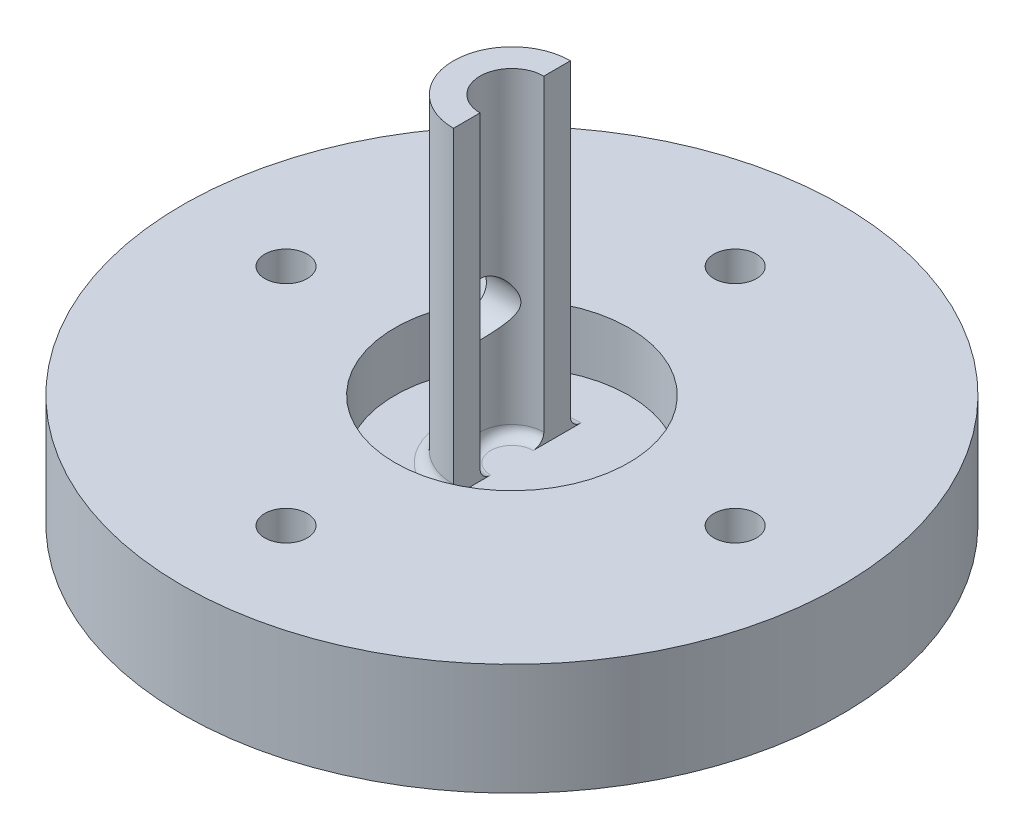
ISO-10303-21;
HEADER;
FILE_DESCRIPTION(('STEP AP214'),'2;1');
FILE_NAME('part.step','',(''),(''),'','','');
FILE_SCHEMA(('AUTOMOTIVE_DESIGN { 1 0 10303 214 1 1 1 1 }'));
ENDSEC;
DATA;
#1=APPLICATION_CONTEXT('core data for automotive mechanical design processes');
#2=APPLICATION_PROTOCOL_DEFINITION('international standard','automotive_design',2000,#1);
#3=PRODUCT_CONTEXT('',#1,'mechanical');
#4=PRODUCT('Part','Part','',(#3));
#5=PRODUCT_RELATED_PRODUCT_CATEGORY('part','',(#4));
#6=PRODUCT_DEFINITION_FORMATION('','',#4);
#7=PRODUCT_DEFINITION_CONTEXT('part definition',#1,'design');
#8=PRODUCT_DEFINITION('design','',#6,#7);
#9=PRODUCT_DEFINITION_SHAPE('','',#8);
#10=(LENGTH_UNIT() NAMED_UNIT(*) SI_UNIT(.MILLI.,.METRE.));
#11=(NAMED_UNIT(*) PLANE_ANGLE_UNIT() SI_UNIT($,.RADIAN.));
#12=(NAMED_UNIT(*) SI_UNIT($,.STERADIAN.) SOLID_ANGLE_UNIT());
#13=UNCERTAINTY_MEASURE_WITH_UNIT(LENGTH_MEASURE(1.E-05),#10,'distance_accuracy_value','');
#14=(GEOMETRIC_REPRESENTATION_CONTEXT(3) GLOBAL_UNCERTAINTY_ASSIGNED_CONTEXT((#13)) GLOBAL_UNIT_ASSIGNED_CONTEXT((#10,
#11,#12)) REPRESENTATION_CONTEXT('',''));
#15=CARTESIAN_POINT('',(0.,0.,0.));
#16=DIRECTION('',(0.,0.,1.));
#17=DIRECTION('',(1.,0.,0.));
#18=AXIS2_PLACEMENT_3D('',#15,#16,#17);
#19=CARTESIAN_POINT('',(0.,0.,0.));
#20=DIRECTION('',(0.,1.,0.));
#21=DIRECTION('',(0.,0.,1.));
#22=AXIS2_PLACEMENT_3D('',#19,#20,#21);
#23=PLANE('',#22);
#24=DIRECTION('',(0.,0.,-1.));
#25=VECTOR('',#24,1.);
#26=CARTESIAN_POINT('',(0.,0.,-5.5));
#27=LINE('',#26,#25);
#28=CARTESIAN_POINT('',(0.,0.,-2.));
#29=VERTEX_POINT('',#28);
#30=CARTESIAN_POINT('',(0.,0.,-6.5));
#31=VERTEX_POINT('',#30);
#32=EDGE_CURVE('E54',#29,#31,#27,.T.);
#33=ORIENTED_EDGE('',*,*,#32,.F.);
#34=CARTESIAN_POINT('',(0.,0.,0.));
#35=DIRECTION('',(0.,1.,0.));
#36=DIRECTION('',(0.,0.,1.));
#37=AXIS2_PLACEMENT_3D('',#34,#35,#36);
#38=CIRCLE('',#37,2.);
#39=CARTESIAN_POINT('',(0.,0.,2.));
#40=VERTEX_POINT('',#39);
#41=EDGE_CURVE('E216',#29,#40,#38,.T.);
#42=ORIENTED_EDGE('',*,*,#41,.T.);
#43=DIRECTION('',(0.,0.,-1.));
#44=VECTOR('',#43,1.);
#45=CARTESIAN_POINT('',(0.,0.,3.));
#46=LINE('',#45,#44);
#47=CARTESIAN_POINT('',(0.,0.,6.5));
#48=VERTEX_POINT('',#47);
#49=EDGE_CURVE('E61',#48,#40,#46,.T.);
#50=ORIENTED_EDGE('',*,*,#49,.F.);
#51=CARTESIAN_POINT('',(0.,0.,0.));
#52=DIRECTION('',(0.,1.,0.));
#53=DIRECTION('',(0.,0.,1.));
#54=AXIS2_PLACEMENT_3D('',#51,#52,#53);
#55=CIRCLE('',#54,6.5);
#56=EDGE_CURVE('E120',#48,#31,#55,.F.);
#57=ORIENTED_EDGE('',*,*,#56,.T.);
#58=EDGE_LOOP('',(#33,#42,#50,#57));
#59=FACE_BOUND('',#58,.T.);
#60=CARTESIAN_POINT('',(0.,0.,0.));
#61=DIRECTION('',(0.,1.,0.));
#62=DIRECTION('',(0.,0.,1.));
#63=AXIS2_PLACEMENT_3D('',#60,#61,#62);
#64=CIRCLE('',#63,11.);
#65=CARTESIAN_POINT('',(0.,0.,11.));
#66=VERTEX_POINT('',#65);
#67=EDGE_CURVE('E134',#66,#66,#64,.F.);
#68=ORIENTED_EDGE('',*,*,#67,.F.);
#69=EDGE_LOOP('',(#68));
#70=FACE_BOUND('',#69,.T.);
#71=ADVANCED_FACE('F38',(#59,#70),#23,.T.);
#72=CARTESIAN_POINT('',(0.,30.,0.));
#73=DIRECTION('',(0.,-1.,0.));
#74=DIRECTION('',(0.,0.,-1.));
#75=AXIS2_PLACEMENT_3D('',#72,#73,#74);
#76=CYLINDRICAL_SURFACE('',#75,5.5);
#77=CARTESIAN_POINT('',(-4.89897948556636,11.,-2.5));
#78=CARTESIAN_POINT('',(-4.8989883713621,11.1320145196123,-2.49999196961874));
#79=CARTESIAN_POINT('',(-4.90439430919214,11.26423901695,-2.48947537601515));
#80=CARTESIAN_POINT('',(-4.92528154342173,11.5247653305509,-2.44787943029992));
#81=CARTESIAN_POINT('',(-4.94078765324622,11.653056669193,-2.41674943342954));
#82=CARTESIAN_POINT('',(-4.97972515950645,11.9014769011873,-2.33545276721963));
#83=CARTESIAN_POINT('',(-5.00312000656303,12.0216404236069,-2.28537376232775));
#84=CARTESIAN_POINT('',(-5.05514370332805,12.2518302308041,-2.16786451789089));
#85=CARTESIAN_POINT('',(-5.08377199859752,12.3618575875661,-2.10043611605766));
#86=CARTESIAN_POINT('',(-5.14541251300062,12.5768942600215,-1.9447848116384));
#87=CARTESIAN_POINT('',(-5.17859023757033,12.6810624609421,-1.85546486301865));
#88=CARTESIAN_POINT('',(-5.24424327844966,12.8735765519715,-1.66086013546987));
#89=CARTESIAN_POINT('',(-5.27671828694639,12.9619156270025,-1.55556851594413));
#90=CARTESIAN_POINT('',(-5.33938487776683,13.1248511318328,-1.32512405386514));
#91=CARTESIAN_POINT('',(-5.3693621425434,13.1984626942159,-1.19921119992471));
#92=CARTESIAN_POINT('',(-5.42157820076016,13.3230849917079,-0.935175493137514));
#93=CARTESIAN_POINT('',(-5.44382105010749,13.3741075762644,-0.797059087602483));
#94=CARTESIAN_POINT('',(-5.47688079234394,13.4489343340397,-0.521404527396841));
#95=CARTESIAN_POINT('',(-5.48830796936361,13.4741994973105,-0.38433772040666));
#96=CARTESIAN_POINT('',(-5.5006923336895,13.5015544806419,-0.107467498429938));
#97=CARTESIAN_POINT('',(-5.50165463974531,13.5036556310718,0.0323345451249085));
#98=CARTESIAN_POINT('',(-5.49333036831599,13.4853019731024,0.29993016170912));
#99=CARTESIAN_POINT('',(-5.48477852249735,13.4664642647041,0.427862159653137));
#100=CARTESIAN_POINT('',(-5.45944031675457,13.4095921336523,0.678516618532182));
#101=CARTESIAN_POINT('',(-5.4426533462381,13.3715562875493,0.801238692444803));
#102=CARTESIAN_POINT('',(-5.40210986402921,13.2769799682102,1.04025925182663));
#103=CARTESIAN_POINT('',(-5.37825173951429,13.220168209595,1.15643244507068));
#104=CARTESIAN_POINT('',(-5.32582034586311,13.0899546662938,1.37789997312266));
#105=CARTESIAN_POINT('',(-5.29724535074113,13.016546805155,1.48319030268059));
#106=CARTESIAN_POINT('',(-5.23541847799083,12.8483004887117,1.68904292536204));
#107=CARTESIAN_POINT('',(-5.20197523607052,12.7522027057257,1.78851976078857));
#108=CARTESIAN_POINT('',(-5.13581955033586,12.5447657539747,1.97046933056352));
#109=CARTESIAN_POINT('',(-5.10310751170601,12.4334183670644,2.05293283580764));
#110=CARTESIAN_POINT('',(-5.04059957618345,12.1923801007188,2.20209013788367));
#111=CARTESIAN_POINT('',(-5.01100237949505,12.0620875000211,2.26790243596468));
#112=CARTESIAN_POINT('',(-4.96057594653589,11.7905793396927,2.37619334831182));
#113=CARTESIAN_POINT('',(-4.93973909056794,11.6493733995297,2.41869225029329));
#114=CARTESIAN_POINT('',(-4.91119669215877,11.3709435791299,2.47610787476164));
#115=CARTESIAN_POINT('',(-4.90264732796546,11.2341753782102,2.49280372821438));
#116=CARTESIAN_POINT('',(-4.89722669202924,10.9595534055787,2.50344178002744));
#117=CARTESIAN_POINT('',(-4.90034990365081,10.8217001774009,2.49739472702013));
#118=CARTESIAN_POINT('',(-4.91703840595107,10.5608634660918,2.46434845386922));
#119=CARTESIAN_POINT('',(-4.92972117384159,10.4375913444395,2.43911853242213));
#120=CARTESIAN_POINT('',(-4.96289406010737,10.1971848051473,2.3708881040298));
#121=CARTESIAN_POINT('',(-4.98338625451043,10.080052028994,2.32788287150712));
#122=CARTESIAN_POINT('',(-5.03098751408293,9.84926952760146,2.2231964595893));
#123=CARTESIAN_POINT('',(-5.05835471140892,9.73601925515909,2.16075614493718));
#124=CARTESIAN_POINT('',(-5.11631673116395,9.52100079889796,2.01968175448662));
#125=CARTESIAN_POINT('',(-5.1469131057585,9.41923818592518,1.94103987364859));
#126=CARTESIAN_POINT('',(-5.21158189816562,9.2194373881308,1.76053571539632));
#127=CARTESIAN_POINT('',(-5.24569526795824,9.12279553267271,1.6571358765209));
#128=CARTESIAN_POINT('',(-5.31079182102949,8.94790177342803,1.43488293637671));
#129=CARTESIAN_POINT('',(-5.34177446894745,8.86965301187917,1.31602720003389));
#130=CARTESIAN_POINT('',(-5.39763225201338,8.73320503343374,1.06412926866568));
#131=CARTESIAN_POINT('',(-5.42243527561898,8.6752396129568,0.930943398080603));
#132=CARTESIAN_POINT('',(-5.462596691244,8.58303908702209,0.655271960994668));
#133=CARTESIAN_POINT('',(-5.47796188747936,8.54878688321482,0.51279317640666));
#134=CARTESIAN_POINT('',(-5.49660137618528,8.50742482093815,0.234932353060252));
#135=CARTESIAN_POINT('',(-5.50074734890855,8.49835661535973,0.0998989268588738));
#136=CARTESIAN_POINT('',(-5.49903067991948,8.5021317403643,-0.169779714943111));
#137=CARTESIAN_POINT('',(-5.49317044733289,8.51496979672562,-0.304425016172092));
#138=CARTESIAN_POINT('',(-5.47259382013855,8.56080556810752,-0.562783999730368));
#139=CARTESIAN_POINT('',(-5.45831522657028,8.59280785015147,-0.686712344734718));
#140=CARTESIAN_POINT('',(-5.42262556787535,8.67487003799566,-0.927328371253358));
#141=CARTESIAN_POINT('',(-5.40121329287862,8.724933007002,-1.04401482055946));
#142=CARTESIAN_POINT('',(-5.35204671901927,8.84419727566028,-1.27275603607864));
#143=CARTESIAN_POINT('',(-5.32404717038585,8.91416910133782,-1.3843549521877));
#144=CARTESIAN_POINT('',(-5.26486798926627,9.07022082603441,-1.59471801782269));
#145=CARTESIAN_POINT('',(-5.23368696968894,9.15630776486059,-1.693476526008));
#146=CARTESIAN_POINT('',(-5.16835233718973,9.35048850452729,-1.88390274978155));
#147=CARTESIAN_POINT('',(-5.13416609785545,9.4598133250708,-1.9743091440203));
#148=CARTESIAN_POINT('',(-5.06911813622376,9.69290566115231,-2.13579923178785));
#149=CARTESIAN_POINT('',(-5.03825861331672,9.81668262015972,-2.20687018881923));
#150=CARTESIAN_POINT('',(-4.98353191567982,10.0770684473751,-2.32785313471118));
#151=CARTESIAN_POINT('',(-4.95972231034886,10.2137715495553,-2.37759232905536));
#152=CARTESIAN_POINT('',(-4.93218350800317,10.4244006587485,-2.43392297581612));
#153=CARTESIAN_POINT('',(-4.92436998560132,10.4954707906762,-2.4496473475699));
#154=CARTESIAN_POINT('',(-4.91174811797804,10.6389546171835,-2.47486081531747));
#155=CARTESIAN_POINT('',(-4.90693754299948,10.7113672736694,-2.48435453798031));
#156=CARTESIAN_POINT('',(-4.90215466676826,10.8199765198005,-2.49377025102295));
#157=CARTESIAN_POINT('',(-4.90096590566191,10.8559293088238,-2.49610476947027));
#158=CARTESIAN_POINT('',(-4.89937708775311,10.9279161773549,-2.49922076810389));
#159=CARTESIAN_POINT('',(-4.89897705908608,10.9639502597168,-2.50000219288878));
#160=CARTESIAN_POINT('',(-4.89897948556636,11.,-2.5));
#161=B_SPLINE_CURVE_WITH_KNOTS('',3,(#77,#78,#79,#80,#81,#82,#83,#84,#85,#86,#87,#88,#89,#90,
#91,#92,#93,#94,#95,#96,#97,#98,#99,#100,#101,#102,#103,#104,#105,#106,#107,#108,#109,#110,#111,
#112,#113,#114,#115,#116,#117,#118,#119,#120,#121,#122,#123,#124,#125,#126,#127,#128,#129,#130,
#131,#132,#133,#134,#135,#136,#137,#138,#139,#140,#141,#142,#143,#144,#145,#146,#147,#148,#149,
#150,#151,#152,#153,#154,#155,#156,#157,#158,#159,#160),.UNSPECIFIED.,.T.,.F.,(4,2,2,2,2,2,2,2,
2,2,2,2,2,2,2,2,2,2,2,2,2,2,2,2,2,2,2,2,2,2,2,2,2,2,2,2,2,2,2,2,2,4),(0.,0.395898980290266,
0.792774265789117,1.18783548804419,1.58285488117992,2.00455964210591,2.42644552997631,
2.87084384854143,3.3150087731019,3.73227994478338,4.14934700474925,4.53631095550913,
4.92330360200238,5.31615183568052,5.70914413938023,6.13417892240266,6.55944366838405,
7.00393462325153,7.44803815840037,7.85988595707045,8.27153913487366,8.64923866815499,
9.02703867774064,9.42198794151111,9.81712791729528,10.2518845211396,10.6867153440007,
11.1264048228952,11.5657769337786,11.9698739999147,12.3738737880762,12.7585157617674,
13.1432230038509,13.5455235288741,13.9480002087458,14.3837526843368,14.8197915044243,
15.2592985714211,15.4786446804323,15.6978277256035,15.8059336095569,15.9140433497565),.UNSPECIFIED.);
#162=CARTESIAN_POINT('',(-4.89897948556636,11.,-2.5));
#163=VERTEX_POINT('',#162);
#164=EDGE_CURVE('E148',#163,#163,#161,.T.);
#165=ORIENTED_EDGE('',*,*,#164,.T.);
#166=EDGE_LOOP('',(#165));
#167=FACE_BOUND('',#166,.T.);
#168=DIRECTION('',(0.,-1.,0.));
#169=VECTOR('',#168,1.);
#170=CARTESIAN_POINT('',(0.,30.,-5.5));
#171=LINE('',#170,#169);
#172=CARTESIAN_POINT('',(0.,30.,-5.5));
#173=VERTEX_POINT('',#172);
#174=CARTESIAN_POINT('',(0.,1.,-5.5));
#175=VERTEX_POINT('',#174);
#176=EDGE_CURVE('E228',#173,#175,#171,.T.);
#177=ORIENTED_EDGE('',*,*,#176,.T.);
#178=CARTESIAN_POINT('',(0.,1.,0.));
#179=DIRECTION('',(0.,1.,0.));
#180=DIRECTION('',(0.,0.,1.));
#181=AXIS2_PLACEMENT_3D('',#178,#179,#180);
#182=CIRCLE('',#181,5.5);
#183=CARTESIAN_POINT('',(0.,1.,5.5));
#184=VERTEX_POINT('',#183);
#185=EDGE_CURVE('E115',#175,#184,#182,.T.);
#186=ORIENTED_EDGE('',*,*,#185,.T.);
#187=DIRECTION('',(0.,-1.,0.));
#188=VECTOR('',#187,1.);
#189=CARTESIAN_POINT('',(0.,30.,5.5));
#190=LINE('',#189,#188);
#191=CARTESIAN_POINT('',(0.,30.,5.5));
#192=VERTEX_POINT('',#191);
#193=EDGE_CURVE('E94',#192,#184,#190,.T.);
#194=ORIENTED_EDGE('',*,*,#193,.F.);
#195=CARTESIAN_POINT('',(0.,30.,0.));
#196=DIRECTION('',(0.,1.,0.));
#197=DIRECTION('',(0.,0.,1.));
#198=AXIS2_PLACEMENT_3D('',#195,#196,#197);
#199=CIRCLE('',#198,5.5);
#200=EDGE_CURVE('E101',#173,#192,#199,.T.);
#201=ORIENTED_EDGE('',*,*,#200,.F.);
#202=EDGE_LOOP('',(#177,#186,#194,#201));
#203=FACE_BOUND('',#202,.T.);
#204=ADVANCED_FACE('F113',(#167,#203),#76,.T.);
#205=CARTESIAN_POINT('',(0.,30.,3.));
#206=DIRECTION('',(-1.,0.,0.));
#207=DIRECTION('',(0.,0.,1.));
#208=AXIS2_PLACEMENT_3D('',#205,#206,#207);
#209=PLANE('',#208);
#210=ORIENTED_EDGE('',*,*,#49,.T.);
#211=CARTESIAN_POINT('',(0.,1.,2.));
#212=DIRECTION('',(-1.,0.,0.));
#213=DIRECTION('',(0.,0.,1.));
#214=AXIS2_PLACEMENT_3D('',#211,#212,#213);
#215=CIRCLE('',#214,1.);
#216=CARTESIAN_POINT('',(0.,1.,3.));
#217=VERTEX_POINT('',#216);
#218=EDGE_CURVE('E11',#40,#217,#215,.T.);
#219=ORIENTED_EDGE('',*,*,#218,.T.);
#220=DIRECTION('',(0.,-1.,0.));
#221=VECTOR('',#220,1.);
#222=CARTESIAN_POINT('',(0.,30.,3.));
#223=LINE('',#222,#221);
#224=CARTESIAN_POINT('',(0.,30.,3.));
#225=VERTEX_POINT('',#224);
#226=EDGE_CURVE('E96',#225,#217,#223,.T.);
#227=ORIENTED_EDGE('',*,*,#226,.F.);
#228=DIRECTION('',(0.,0.,-1.));
#229=VECTOR('',#228,1.);
#230=CARTESIAN_POINT('',(0.,30.,3.));
#231=LINE('',#230,#229);
#232=EDGE_CURVE('E90',#192,#225,#231,.T.);
#233=ORIENTED_EDGE('',*,*,#232,.F.);
#234=ORIENTED_EDGE('',*,*,#193,.T.);
#235=CARTESIAN_POINT('',(0.,1.,6.5));
#236=DIRECTION('',(-1.,0.,0.));
#237=DIRECTION('',(0.,0.,1.));
#238=AXIS2_PLACEMENT_3D('',#235,#236,#237);
#239=CIRCLE('',#238,1.);
#240=EDGE_CURVE('E128',#184,#48,#239,.T.);
#241=ORIENTED_EDGE('',*,*,#240,.T.);
#242=EDGE_LOOP('',(#210,#219,#227,#233,#234,#241));
#243=FACE_BOUND('',#242,.T.);
#244=ADVANCED_FACE('F92',(#243),#209,.F.);
#245=CARTESIAN_POINT('',(0.,30.,0.));
#246=DIRECTION('',(0.,-1.,0.));
#247=DIRECTION('',(0.,0.,-1.));
#248=AXIS2_PLACEMENT_3D('',#245,#246,#247);
#249=CYLINDRICAL_SURFACE('',#248,3.);
#250=CARTESIAN_POINT('',(-1.6583123951777,11.,-2.5));
#251=CARTESIAN_POINT('',(-1.65832848527777,10.9116955898144,-2.49999381779257));
#252=CARTESIAN_POINT('',(-1.6655210686776,10.8232402139902,-2.49526266006824));
#253=CARTESIAN_POINT('',(-1.69279627564258,10.6492221160973,-2.47682990119872));
#254=CARTESIAN_POINT('',(-1.71292318814634,10.5636704003149,-2.46309747522165));
#255=CARTESIAN_POINT('',(-1.7723311567861,10.3648946893577,-2.42086856120701));
#256=CARTESIAN_POINT('',(-1.81601359579225,10.2538083455126,-2.38871146123827));
#257=CARTESIAN_POINT('',(-1.91336767201443,10.0408221834248,-2.31147102501776));
#258=CARTESIAN_POINT('',(-1.96707143083862,9.938953515347,-2.26634586338956));
#259=CARTESIAN_POINT('',(-2.0633128033891,9.77095438598783,-2.1784743531554));
#260=CARTESIAN_POINT('',(-2.10482488185012,9.70273840864474,-2.1385289521929));
#261=CARTESIAN_POINT('',(-2.18866644492365,9.57071289960258,-2.05264418187203));
#262=CARTESIAN_POINT('',(-2.23099627404093,9.50690527926241,-2.00670223718894));
#263=CARTESIAN_POINT('',(-2.35727388143592,9.3222432323964,-1.86006177209498));
#264=CARTESIAN_POINT('',(-2.44068431676979,9.20786336757605,-1.75039822318641));
#265=CARTESIAN_POINT('',(-2.58108364411647,9.02140599421136,-1.53331236095276));
#266=CARTESIAN_POINT('',(-2.63992409122052,8.94550177742018,-1.43034863494402));
#267=CARTESIAN_POINT('',(-2.74775790284001,8.8086629426078,-1.2102730649704));
#268=CARTESIAN_POINT('',(-2.79676719280152,8.74770407848938,-1.0931846025589));
#269=CARTESIAN_POINT('',(-2.8737292379046,8.65288713492725,-0.867930574105452));
#270=CARTESIAN_POINT('',(-2.90385730730848,8.61616603534432,-0.761720558967915));
#271=CARTESIAN_POINT('',(-2.9526038261635,8.55701959031366,-0.54283416500917));
#272=CARTESIAN_POINT('',(-2.97122890852624,8.53458600609192,-0.430161553726256));
#273=CARTESIAN_POINT('',(-2.99549160197878,8.50539850435466,-0.200906197669825));
#274=CARTESIAN_POINT('',(-3.00107488956406,8.49871017025246,-0.0843091426465959));
#275=CARTESIAN_POINT('',(-2.99858143529682,8.5017022451153,0.148527393661065));
#276=CARTESIAN_POINT('',(-2.99050499605651,8.51138229146168,0.264766882809717));
#277=CARTESIAN_POINT('',(-2.96241335973365,8.54521424954371,0.485446031322614));
#278=CARTESIAN_POINT('',(-2.9432359451617,8.56835111784581,0.590154005534435));
#279=CARTESIAN_POINT('',(-2.89501312358898,8.62694783123245,0.793626256853987));
#280=CARTESIAN_POINT('',(-2.86596630103235,8.66240944405514,0.892389678949309));
#281=CARTESIAN_POINT('',(-2.79690305459733,8.74759117145122,1.09053364635439));
#282=CARTESIAN_POINT('',(-2.7561606192345,8.79827176916426,1.18924374927733));
#283=CARTESIAN_POINT('',(-2.66744762527376,8.91039669293701,1.37677917974558));
#284=CARTESIAN_POINT('',(-2.61947057552121,8.97185069341148,1.46559550453314));
#285=CARTESIAN_POINT('',(-2.4944878939135,9.13545932447426,1.67280381279727));
#286=CARTESIAN_POINT('',(-2.41452783856826,9.24307122339785,1.78517417530476));
#287=CARTESIAN_POINT('',(-2.29203945368863,9.41724030272301,1.93670187620854));
#288=CARTESIAN_POINT('',(-2.25072631897241,9.477514168307,1.98442734415742));
#289=CARTESIAN_POINT('',(-2.16828375986482,9.60227178548926,2.07418694298424));
#290=CARTESIAN_POINT('',(-2.12715427459339,9.66675401099492,2.11622312017879));
#291=CARTESIAN_POINT('',(-2.02736013921577,9.83111860447412,2.21282833126485));
#292=CARTESIAN_POINT('',(-1.96948181658003,9.93346359943393,2.26407571910762));
#293=CARTESIAN_POINT('',(-1.86213853666711,10.1478611715372,2.35314050085765));
#294=CARTESIAN_POINT('',(-1.81264991817823,10.2598850556269,2.39099600305927));
#295=CARTESIAN_POINT('',(-1.74376607660708,10.455820452512,2.4414108954061));
#296=CARTESIAN_POINT('',(-1.71981949257404,10.5369987502834,2.45819358164965));
#297=CARTESIAN_POINT('',(-1.68277668804568,10.7029611456747,2.4837027322215));
#298=CARTESIAN_POINT('',(-1.66965496020135,10.787736268895,2.49244814091896));
#299=CARTESIAN_POINT('',(-1.65659310081955,10.9594277065705,2.50115517387014));
#300=CARTESIAN_POINT('',(-1.65674814862692,11.0463550146674,2.5010533736449));
#301=CARTESIAN_POINT('',(-1.67045143445787,11.2187056875135,2.49191597272525));
#302=CARTESIAN_POINT('',(-1.68401821733786,11.3041268031302,2.48286800185719));
#303=CARTESIAN_POINT('',(-1.72679886038489,11.492184457339,2.45336046117379));
#304=CARTESIAN_POINT('',(-1.75909755109211,11.5937249685046,2.43059717464989));
#305=CARTESIAN_POINT('',(-1.83446297156781,11.7896324463994,2.3742256798351));
#306=CARTESIAN_POINT('',(-1.87756517999228,11.8839744146928,2.34058163140776));
#307=CARTESIAN_POINT('',(-1.95968409590128,12.0459947832933,2.27197464095646));
#308=CARTESIAN_POINT('',(-1.99758766640253,12.1150457397477,2.23884949579966));
#309=CARTESIAN_POINT('',(-2.07535316303084,12.2490284972076,2.16695951166941));
#310=CARTESIAN_POINT('',(-2.11521609327316,12.3139581462736,2.12819176063911));
#311=CARTESIAN_POINT('',(-2.19562728957069,12.4398339058265,2.04513177456923));
#312=CARTESIAN_POINT('',(-2.23617609161423,12.5007767007639,2.00083502832488));
#313=CARTESIAN_POINT('',(-2.31689068931586,12.6185849491005,1.90679633939305));
#314=CARTESIAN_POINT('',(-2.35705627447809,12.6754482622183,1.85705157250686));
#315=CARTESIAN_POINT('',(-2.47761126043941,12.842454835183,1.69691470794631));
#316=CARTESIAN_POINT('',(-2.55601135420397,12.9459375387194,1.57762869702065));
#317=CARTESIAN_POINT('',(-2.66368994822278,13.0847206330606,1.38213833429725));
#318=CARTESIAN_POINT('',(-2.69790353664307,13.128210529514,1.31428144251981));
#319=CARTESIAN_POINT('',(-2.76217044277536,13.2091167410337,1.17320567310928));
#320=CARTESIAN_POINT('',(-2.79222622145722,13.2465366511533,1.09999000687015));
#321=CARTESIAN_POINT('',(-2.85642765987167,13.3259173496435,0.923231349702335));
#322=CARTESIAN_POINT('',(-2.88858366145246,13.3652168240664,0.817729906619425));
#323=CARTESIAN_POINT('',(-2.94156350531484,13.4296362482505,0.599797532910357));
#324=CARTESIAN_POINT('',(-2.96239616816155,13.4547672354385,0.487372072128387));
#325=CARTESIAN_POINT('',(-2.99113754779354,13.4893771518451,0.25790401458945));
#326=CARTESIAN_POINT('',(-2.99898403281667,13.4987807150835,0.140841922250433));
#327=CARTESIAN_POINT('',(-3.00082959064104,13.5009956315283,-0.0935504369182168));
#328=CARTESIAN_POINT('',(-2.99482967474112,13.4938081964905,-0.210880683537407));
#329=CARTESIAN_POINT('',(-2.97047572120601,13.4645049529809,-0.433478999214012));
#330=CARTESIAN_POINT('',(-2.95305281328287,13.4435139632413,-0.539003381840969));
#331=CARTESIAN_POINT('',(-2.9080705750889,13.3889561477362,-0.74444222662288));
#332=CARTESIAN_POINT('',(-2.88050965969777,13.3553873553629,-0.844355808688066));
#333=CARTESIAN_POINT('',(-2.81464343863442,13.274382844718,-1.0438405515299));
#334=CARTESIAN_POINT('',(-2.77570403743571,13.2261182278953,-1.1428617285401));
#335=CARTESIAN_POINT('',(-2.69039800671957,13.1187950671165,-1.33135097301228));
#336=CARTESIAN_POINT('',(-2.64402565415891,13.0597282009271,-1.42081159008166));
#337=CARTESIAN_POINT('',(-2.52264851028665,12.9019562523743,-1.63002558091946));
#338=CARTESIAN_POINT('',(-2.44452820472334,12.7977736432511,-1.74390511945051));
#339=CARTESIAN_POINT('',(-2.3241333194184,12.6288462707238,-1.89807730985018));
#340=CARTESIAN_POINT('',(-2.28340098508491,12.5703286995019,-1.94675534900063));
#341=CARTESIAN_POINT('',(-2.20183068446821,12.449158530274,-2.03855478653209));
#342=CARTESIAN_POINT('',(-2.16099275466,12.3865072138427,-2.08167789496707));
#343=CARTESIAN_POINT('',(-2.05749735800433,12.2205083114875,-2.18509588569703));
#344=CARTESIAN_POINT('',(-1.99554062285107,12.1141576516537,-2.24133685872228));
#345=CARTESIAN_POINT('',(-1.8799763526203,11.8907443152895,-2.33909634990328));
#346=CARTESIAN_POINT('',(-1.82634630603961,11.773711928944,-2.38065496503422));
#347=CARTESIAN_POINT('',(-1.7519710712173,11.5701257635374,-2.43556494992112));
#348=CARTESIAN_POINT('',(-1.72624379189026,11.4867262077984,-2.4537026175718));
#349=CARTESIAN_POINT('',(-1.68613426001934,11.315972131174,-2.48144437754558));
#350=CARTESIAN_POINT('',(-1.67170839549487,11.2286342030673,-2.49108129246948));
#351=CARTESIAN_POINT('',(-1.66228358000323,11.1172086751865,-2.49736160836694));
#352=CARTESIAN_POINT('',(-1.66079886805539,11.0938071751244,-2.49834926640805));
#353=CARTESIAN_POINT('',(-1.65881104526667,11.0469406806078,-2.49966934514013));
#354=CARTESIAN_POINT('',(-1.65830811763413,11.0234756751207,-2.50000164353618));
#355=CARTESIAN_POINT('',(-1.6583123951777,11.,-2.5));
#356=B_SPLINE_CURVE_WITH_KNOTS('',3,(#250,#251,#252,#253,#254,#255,#256,#257,#258,#259,#260,
#261,#262,#263,#264,#265,#266,#267,#268,#269,#270,#271,#272,#273,#274,#275,#276,#277,#278,#279,
#280,#281,#282,#283,#284,#285,#286,#287,#288,#289,#290,#291,#292,#293,#294,#295,#296,#297,#298,
#299,#300,#301,#302,#303,#304,#305,#306,#307,#308,#309,#310,#311,#312,#313,#314,#315,#316,#317,
#318,#319,#320,#321,#322,#323,#324,#325,#326,#327,#328,#329,#330,#331,#332,#333,#334,#335,#336,
#337,#338,#339,#340,#341,#342,#343,#344,#345,#346,#347,#348,#349,#350,#351,#352,#353,#354,#355),
.UNSPECIFIED.,.T.,.F.,(4,2,2,2,2,2,2,2,2,2,2,2,2,2,2,2,2,2,2,2,2,2,2,2,2,2,2,2,2,2,2,2,2,2,2,2,
2,2,2,2,2,2,2,2,2,2,2,2,2,2,2,2,4),(0.,0.26480748684396,0.530526577859135,0.899311711113917,
1.26929988428696,1.53684271887073,1.80450083499514,2.33872733232382,2.75963734355717,
3.17985991852653,3.52745225260399,3.87484396861114,4.22368012855136,4.57250856061374,
4.89792180788528,5.22338174845522,5.57669292749804,5.93032301720748,6.45212646169813,
6.71375344417635,6.97528607349792,7.35902155845295,7.74165612186457,7.99961659145732,
8.25696746076718,8.51616339578941,8.77571823174391,9.10077852677669,9.42692063321701,
9.68296205217761,9.9391360815788,10.1955205112228,10.4520384827407,10.9775613091595,
11.2398627749287,11.502008316419,11.8517559716833,12.201230791394,12.5523755496757,
12.903494662228,13.2290536025831,13.5546634671053,13.9038797714121,14.2533662599301,
14.7693582552692,15.0281495003973,15.2868608867407,15.691662084526,16.0953490806584,
16.3618811606765,16.6273795605045,16.697765340701,16.7681642541596),.UNSPECIFIED.);
#357=CARTESIAN_POINT('',(-1.6583123951777,11.,-2.5));
#358=VERTEX_POINT('',#357);
#359=EDGE_CURVE('E139',#358,#358,#356,.T.);
#360=ORIENTED_EDGE('',*,*,#359,.T.);
#361=EDGE_LOOP('',(#360));
#362=FACE_BOUND('',#361,.T.);
#363=ORIENTED_EDGE('',*,*,#226,.T.);
#364=CARTESIAN_POINT('',(0.,1.,0.));
#365=DIRECTION('',(0.,1.,0.));
#366=DIRECTION('',(0.,0.,1.));
#367=AXIS2_PLACEMENT_3D('',#364,#365,#366);
#368=CIRCLE('',#367,3.);
#369=CARTESIAN_POINT('',(0.,1.,-3.));
#370=VERTEX_POINT('',#369);
#371=EDGE_CURVE('E138',#217,#370,#368,.F.);
#372=ORIENTED_EDGE('',*,*,#371,.T.);
#373=DIRECTION('',(0.,-1.,0.));
#374=VECTOR('',#373,1.);
#375=CARTESIAN_POINT('',(0.,30.,-3.));
#376=LINE('',#375,#374);
#377=CARTESIAN_POINT('',(0.,30.,-3.));
#378=VERTEX_POINT('',#377);
#379=EDGE_CURVE('E122',#378,#370,#376,.T.);
#380=ORIENTED_EDGE('',*,*,#379,.F.);
#381=CARTESIAN_POINT('',(0.,30.,0.));
#382=DIRECTION('',(0.,-1.,0.));
#383=DIRECTION('',(0.,0.,1.));
#384=AXIS2_PLACEMENT_3D('',#381,#382,#383);
#385=CIRCLE('',#384,3.);
#386=EDGE_CURVE('E100',#225,#378,#385,.T.);
#387=ORIENTED_EDGE('',*,*,#386,.F.);
#388=EDGE_LOOP('',(#363,#372,#380,#387));
#389=FACE_BOUND('',#388,.T.);
#390=ADVANCED_FACE('F150',(#362,#389),#249,.F.);
#391=CARTESIAN_POINT('',(0.,30.,-5.5));
#392=DIRECTION('',(-1.,0.,0.));
#393=DIRECTION('',(0.,0.,1.));
#394=AXIS2_PLACEMENT_3D('',#391,#392,#393);
#395=PLANE('',#394);
#396=ORIENTED_EDGE('',*,*,#32,.T.);
#397=CARTESIAN_POINT('',(0.,1.,-6.5));
#398=DIRECTION('',(-1.,0.,0.));
#399=DIRECTION('',(0.,0.,1.));
#400=AXIS2_PLACEMENT_3D('',#397,#398,#399);
#401=CIRCLE('',#400,1.);
#402=EDGE_CURVE('E131',#31,#175,#401,.T.);
#403=ORIENTED_EDGE('',*,*,#402,.T.);
#404=ORIENTED_EDGE('',*,*,#176,.F.);
#405=DIRECTION('',(0.,0.,-1.));
#406=VECTOR('',#405,1.);
#407=CARTESIAN_POINT('',(0.,30.,-5.5));
#408=LINE('',#407,#406);
#409=EDGE_CURVE('E106',#378,#173,#408,.T.);
#410=ORIENTED_EDGE('',*,*,#409,.F.);
#411=ORIENTED_EDGE('',*,*,#379,.T.);
#412=CARTESIAN_POINT('',(0.,1.,-2.));
#413=DIRECTION('',(-1.,0.,0.));
#414=DIRECTION('',(0.,0.,1.));
#415=AXIS2_PLACEMENT_3D('',#412,#413,#414);
#416=CIRCLE('',#415,1.);
#417=EDGE_CURVE('E47',#370,#29,#416,.T.);
#418=ORIENTED_EDGE('',*,*,#417,.T.);
#419=EDGE_LOOP('',(#396,#403,#404,#410,#411,#418));
#420=FACE_BOUND('',#419,.T.);
#421=ADVANCED_FACE('F187',(#420),#395,.F.);
#422=CARTESIAN_POINT('',(0.,30.,0.));
#423=DIRECTION('',(0.,1.,0.));
#424=DIRECTION('',(0.,0.,1.));
#425=AXIS2_PLACEMENT_3D('',#422,#423,#424);
#426=PLANE('',#425);
#427=ORIENTED_EDGE('',*,*,#200,.T.);
#428=ORIENTED_EDGE('',*,*,#232,.T.);
#429=ORIENTED_EDGE('',*,*,#386,.T.);
#430=ORIENTED_EDGE('',*,*,#409,.T.);
#431=EDGE_LOOP('',(#427,#428,#429,#430));
#432=FACE_BOUND('',#431,.T.);
#433=ADVANCED_FACE('F104',(#432),#426,.T.);
#434=CARTESIAN_POINT('',(0.,1.,0.));
#435=DIRECTION('',(0.,1.,0.));
#436=DIRECTION('',(0.,0.,1.));
#437=AXIS2_PLACEMENT_3D('',#434,#435,#436);
#438=TOROIDAL_SURFACE('',#437,6.5,1.);
#439=ORIENTED_EDGE('',*,*,#402,.F.);
#440=ORIENTED_EDGE('',*,*,#56,.F.);
#441=ORIENTED_EDGE('',*,*,#240,.F.);
#442=ORIENTED_EDGE('',*,*,#185,.F.);
#443=EDGE_LOOP('',(#439,#440,#441,#442));
#444=FACE_BOUND('',#443,.T.);
#445=ADVANCED_FACE('F176',(#444),#438,.F.);
#446=CARTESIAN_POINT('',(0.,5.5,0.));
#447=DIRECTION('',(0.,1.,0.));
#448=DIRECTION('',(0.,0.,1.));
#449=AXIS2_PLACEMENT_3D('',#446,#447,#448);
#450=PLANE('',#449);
#451=CARTESIAN_POINT('',(0.,5.5,-21.));
#452=DIRECTION('',(0.,1.,0.));
#453=DIRECTION('',(0.,0.,1.));
#454=AXIS2_PLACEMENT_3D('',#451,#452,#453);
#455=CIRCLE('',#454,2.);
#456=CARTESIAN_POINT('',(0.,5.5,-19.));
#457=VERTEX_POINT('',#456);
#458=EDGE_CURVE('E364',#457,#457,#455,.T.);
#459=ORIENTED_EDGE('',*,*,#458,.F.);
#460=EDGE_LOOP('',(#459));
#461=FACE_BOUND('',#460,.T.);
#462=CARTESIAN_POINT('',(21.125,5.5,0.124999999999994));
#463=DIRECTION('',(0.,1.,0.));
#464=DIRECTION('',(0.,0.,1.));
#465=AXIS2_PLACEMENT_3D('',#462,#463,#464);
#466=CIRCLE('',#465,2.);
#467=CARTESIAN_POINT('',(21.125,5.5,2.125));
#468=VERTEX_POINT('',#467);
#469=EDGE_CURVE('E371',#468,#468,#466,.T.);
#470=ORIENTED_EDGE('',*,*,#469,.F.);
#471=EDGE_LOOP('',(#470));
#472=FACE_BOUND('',#471,.T.);
#473=CARTESIAN_POINT('',(0.,5.5,21.25));
#474=DIRECTION('',(0.,1.,0.));
#475=DIRECTION('',(0.,0.,1.));
#476=AXIS2_PLACEMENT_3D('',#473,#474,#475);
#477=CIRCLE('',#476,2.);
#478=CARTESIAN_POINT('',(0.,5.5,23.25));
#479=VERTEX_POINT('',#478);
#480=EDGE_CURVE('E379',#479,#479,#477,.T.);
#481=ORIENTED_EDGE('',*,*,#480,.F.);
#482=EDGE_LOOP('',(#481));
#483=FACE_BOUND('',#482,.T.);
#484=CARTESIAN_POINT('',(-21.125,5.5,0.125000000000003));
#485=DIRECTION('',(0.,1.,0.));
#486=DIRECTION('',(0.,0.,1.));
#487=AXIS2_PLACEMENT_3D('',#484,#485,#486);
#488=CIRCLE('',#487,2.);
#489=CARTESIAN_POINT('',(-21.125,5.5,2.12500000000001));
#490=VERTEX_POINT('',#489);
#491=EDGE_CURVE('E383',#490,#490,#488,.T.);
#492=ORIENTED_EDGE('',*,*,#491,.F.);
#493=EDGE_LOOP('',(#492));
#494=FACE_BOUND('',#493,.T.);
#495=CARTESIAN_POINT('',(0.,5.5,0.));
#496=DIRECTION('',(0.,1.,0.));
#497=DIRECTION('',(0.,0.,1.));
#498=AXIS2_PLACEMENT_3D('',#495,#496,#497);
#499=CIRCLE('',#498,31.);
#500=CARTESIAN_POINT('',(0.,5.5,31.));
#501=VERTEX_POINT('',#500);
#502=EDGE_CURVE('E223',#501,#501,#499,.T.);
#503=ORIENTED_EDGE('',*,*,#502,.T.);
#504=EDGE_LOOP('',(#503));
#505=FACE_BOUND('',#504,.T.);
#506=CARTESIAN_POINT('',(0.,5.5,0.));
#507=DIRECTION('',(0.,1.,0.));
#508=DIRECTION('',(0.,0.,1.));
#509=AXIS2_PLACEMENT_3D('',#506,#507,#508);
#510=CIRCLE('',#509,11.);
#511=CARTESIAN_POINT('',(0.,5.5,11.));
#512=VERTEX_POINT('',#511);
#513=EDGE_CURVE('E360',#512,#512,#510,.T.);
#514=ORIENTED_EDGE('',*,*,#513,.F.);
#515=EDGE_LOOP('',(#514));
#516=FACE_BOUND('',#515,.T.);
#517=ADVANCED_FACE('F178',(#461,#472,#483,#494,#505,#516),#450,.T.);
#518=CARTESIAN_POINT('',(0.,5.5,0.));
#519=DIRECTION('',(0.,-1.,0.));
#520=DIRECTION('',(0.,0.,-1.));
#521=AXIS2_PLACEMENT_3D('',#518,#519,#520);
#522=CYLINDRICAL_SURFACE('',#521,11.);
#523=ORIENTED_EDGE('',*,*,#513,.T.);
#524=EDGE_LOOP('',(#523));
#525=FACE_BOUND('',#524,.T.);
#526=ORIENTED_EDGE('',*,*,#67,.T.);
#527=EDGE_LOOP('',(#526));
#528=FACE_BOUND('',#527,.T.);
#529=ADVANCED_FACE('F184',(#525,#528),#522,.F.);
#530=CARTESIAN_POINT('',(0.,-5.,0.));
#531=DIRECTION('',(0.,1.,0.));
#532=DIRECTION('',(0.,0.,1.));
#533=AXIS2_PLACEMENT_3D('',#530,#531,#532);
#534=PLANE('',#533);
#535=CARTESIAN_POINT('',(0.,-5.,-21.));
#536=DIRECTION('',(0.,1.,0.));
#537=DIRECTION('',(0.,0.,1.));
#538=AXIS2_PLACEMENT_3D('',#535,#536,#537);
#539=CIRCLE('',#538,2.);
#540=CARTESIAN_POINT('',(0.,-5.,-19.));
#541=VERTEX_POINT('',#540);
#542=EDGE_CURVE('E171',#541,#541,#539,.T.);
#543=ORIENTED_EDGE('',*,*,#542,.T.);
#544=EDGE_LOOP('',(#543));
#545=FACE_BOUND('',#544,.T.);
#546=CARTESIAN_POINT('',(21.125,-5.,0.124999999999994));
#547=DIRECTION('',(0.,1.,0.));
#548=DIRECTION('',(0.,0.,1.));
#549=AXIS2_PLACEMENT_3D('',#546,#547,#548);
#550=CIRCLE('',#549,2.);
#551=CARTESIAN_POINT('',(21.125,-5.,2.125));
#552=VERTEX_POINT('',#551);
#553=EDGE_CURVE('E393',#552,#552,#550,.T.);
#554=ORIENTED_EDGE('',*,*,#553,.T.);
#555=EDGE_LOOP('',(#554));
#556=FACE_BOUND('',#555,.T.);
#557=CARTESIAN_POINT('',(0.,-5.,21.25));
#558=DIRECTION('',(0.,1.,0.));
#559=DIRECTION('',(0.,0.,1.));
#560=AXIS2_PLACEMENT_3D('',#557,#558,#559);
#561=CIRCLE('',#560,2.);
#562=CARTESIAN_POINT('',(0.,-5.,23.25));
#563=VERTEX_POINT('',#562);
#564=EDGE_CURVE('E390',#563,#563,#561,.T.);
#565=ORIENTED_EDGE('',*,*,#564,.T.);
#566=EDGE_LOOP('',(#565));
#567=FACE_BOUND('',#566,.T.);
#568=CARTESIAN_POINT('',(-21.125,-5.,0.125000000000003));
#569=DIRECTION('',(0.,1.,0.));
#570=DIRECTION('',(0.,0.,1.));
#571=AXIS2_PLACEMENT_3D('',#568,#569,#570);
#572=CIRCLE('',#571,2.);
#573=CARTESIAN_POINT('',(-21.125,-5.,2.12500000000001));
#574=VERTEX_POINT('',#573);
#575=EDGE_CURVE('E170',#574,#574,#572,.T.);
#576=ORIENTED_EDGE('',*,*,#575,.T.);
#577=EDGE_LOOP('',(#576));
#578=FACE_BOUND('',#577,.T.);
#579=CARTESIAN_POINT('',(0.,-5.,0.));
#580=DIRECTION('',(0.,1.,0.));
#581=DIRECTION('',(0.,0.,1.));
#582=AXIS2_PLACEMENT_3D('',#579,#580,#581);
#583=CIRCLE('',#582,31.);
#584=CARTESIAN_POINT('',(0.,-5.,31.));
#585=VERTEX_POINT('',#584);
#586=EDGE_CURVE('E219',#585,#585,#583,.T.);
#587=ORIENTED_EDGE('',*,*,#586,.F.);
#588=EDGE_LOOP('',(#587));
#589=FACE_BOUND('',#588,.T.);
#590=ADVANCED_FACE('F199',(#545,#556,#567,#578,#589),#534,.F.);
#591=CARTESIAN_POINT('',(0.,-5.,0.));
#592=DIRECTION('',(0.,1.,0.));
#593=DIRECTION('',(0.,0.,1.));
#594=AXIS2_PLACEMENT_3D('',#591,#592,#593);
#595=CYLINDRICAL_SURFACE('',#594,31.);
#596=ORIENTED_EDGE('',*,*,#586,.T.);
#597=EDGE_LOOP('',(#596));
#598=FACE_BOUND('',#597,.T.);
#599=ORIENTED_EDGE('',*,*,#502,.F.);
#600=EDGE_LOOP('',(#599));
#601=FACE_BOUND('',#600,.T.);
#602=ADVANCED_FACE('F200',(#598,#601),#595,.T.);
#603=CARTESIAN_POINT('',(-21.125,-5.,0.125000000000003));
#604=DIRECTION('',(0.,1.,0.));
#605=DIRECTION('',(0.,0.,1.));
#606=AXIS2_PLACEMENT_3D('',#603,#604,#605);
#607=CYLINDRICAL_SURFACE('',#606,2.);
#608=ORIENTED_EDGE('',*,*,#491,.T.);
#609=EDGE_LOOP('',(#608));
#610=FACE_BOUND('',#609,.T.);
#611=ORIENTED_EDGE('',*,*,#575,.F.);
#612=EDGE_LOOP('',(#611));
#613=FACE_BOUND('',#612,.T.);
#614=ADVANCED_FACE('F202',(#610,#613),#607,.F.);
#615=CARTESIAN_POINT('',(0.,-5.,21.25));
#616=DIRECTION('',(0.,1.,0.));
#617=DIRECTION('',(0.,0.,1.));
#618=AXIS2_PLACEMENT_3D('',#615,#616,#617);
#619=CYLINDRICAL_SURFACE('',#618,2.);
#620=ORIENTED_EDGE('',*,*,#480,.T.);
#621=EDGE_LOOP('',(#620));
#622=FACE_BOUND('',#621,.T.);
#623=ORIENTED_EDGE('',*,*,#564,.F.);
#624=EDGE_LOOP('',(#623));
#625=FACE_BOUND('',#624,.T.);
#626=ADVANCED_FACE('F258',(#622,#625),#619,.F.);
#627=CARTESIAN_POINT('',(21.125,-5.,0.124999999999994));
#628=DIRECTION('',(0.,1.,0.));
#629=DIRECTION('',(0.,0.,1.));
#630=AXIS2_PLACEMENT_3D('',#627,#628,#629);
#631=CYLINDRICAL_SURFACE('',#630,2.);
#632=ORIENTED_EDGE('',*,*,#469,.T.);
#633=EDGE_LOOP('',(#632));
#634=FACE_BOUND('',#633,.T.);
#635=ORIENTED_EDGE('',*,*,#553,.F.);
#636=EDGE_LOOP('',(#635));
#637=FACE_BOUND('',#636,.T.);
#638=ADVANCED_FACE('F251',(#634,#637),#631,.F.);
#639=CARTESIAN_POINT('',(0.,-5.,-21.));
#640=DIRECTION('',(0.,1.,0.));
#641=DIRECTION('',(0.,0.,1.));
#642=AXIS2_PLACEMENT_3D('',#639,#640,#641);
#643=CYLINDRICAL_SURFACE('',#642,2.);
#644=ORIENTED_EDGE('',*,*,#458,.T.);
#645=EDGE_LOOP('',(#644));
#646=FACE_BOUND('',#645,.T.);
#647=ORIENTED_EDGE('',*,*,#542,.F.);
#648=EDGE_LOOP('',(#647));
#649=FACE_BOUND('',#648,.T.);
#650=ADVANCED_FACE('F158',(#646,#649),#643,.F.);
#651=CARTESIAN_POINT('',(-31.,11.,0.));
#652=DIRECTION('',(1.,0.,0.));
#653=DIRECTION('',(0.,0.,-1.));
#654=AXIS2_PLACEMENT_3D('',#651,#652,#653);
#655=CYLINDRICAL_SURFACE('',#654,2.5);
#656=ORIENTED_EDGE('',*,*,#359,.F.);
#657=EDGE_LOOP('',(#656));
#658=FACE_BOUND('',#657,.T.);
#659=ORIENTED_EDGE('',*,*,#164,.F.);
#660=EDGE_LOOP('',(#659));
#661=FACE_BOUND('',#660,.T.);
#662=ADVANCED_FACE('F154',(#658,#661),#655,.F.);
#663=CARTESIAN_POINT('',(0.,1.,0.));
#664=DIRECTION('',(0.,1.,0.));
#665=DIRECTION('',(0.,0.,1.));
#666=AXIS2_PLACEMENT_3D('',#663,#664,#665);
#667=TOROIDAL_SURFACE('',#666,2.,1.);
#668=ORIENTED_EDGE('',*,*,#218,.F.);
#669=ORIENTED_EDGE('',*,*,#41,.F.);
#670=ORIENTED_EDGE('',*,*,#417,.F.);
#671=ORIENTED_EDGE('',*,*,#371,.F.);
#672=EDGE_LOOP('',(#668,#669,#670,#671));
#673=FACE_BOUND('',#672,.T.);
#674=ADVANCED_FACE('F40',(#673),#667,.F.);
#675=CLOSED_SHELL('',(#71,#204,#244,#390,#421,#433,#445,#517,#529,#590,#602,#614,#626,#638,#650,
#662,#674));
#676=MANIFOLD_SOLID_BREP('B2',#675);
#677=ADVANCED_BREP_SHAPE_REPRESENTATION('',(#18,#676),#14);
#678=SHAPE_DEFINITION_REPRESENTATION(#9,#677);
ENDSEC;
END-ISO-10303-21;
